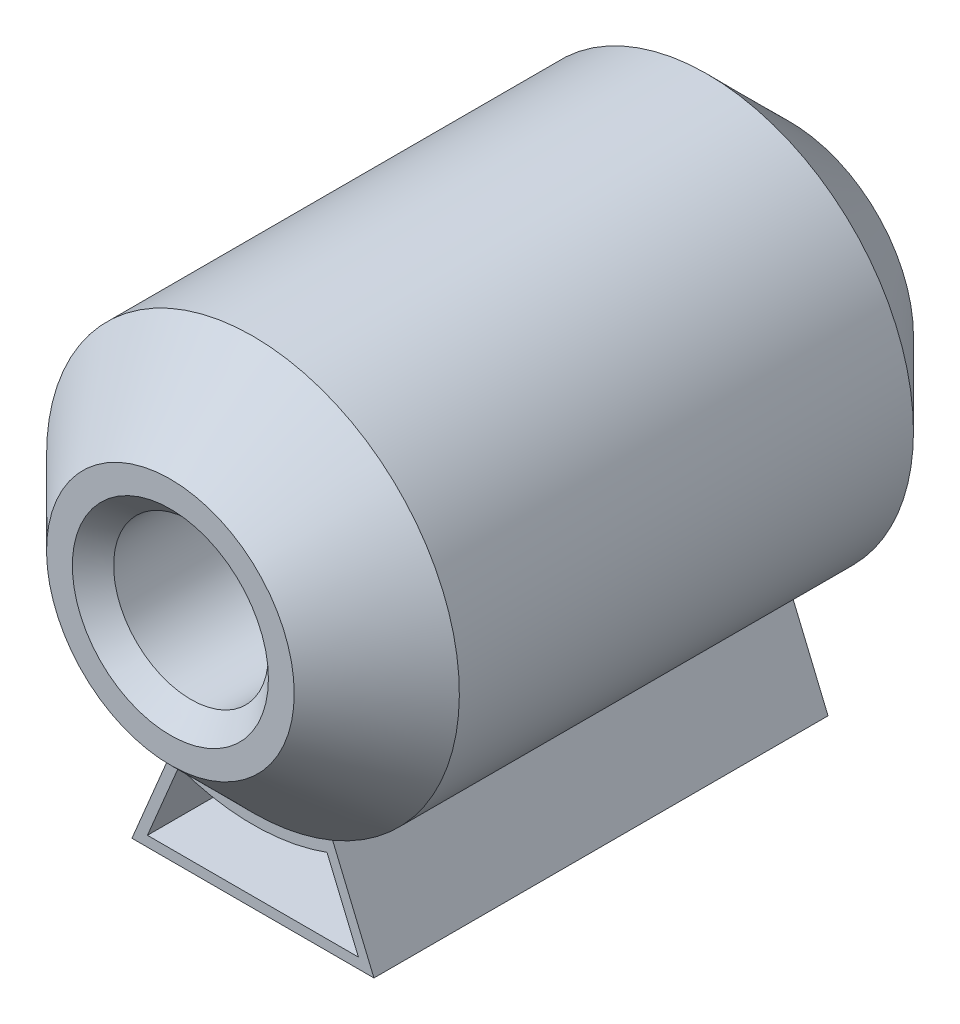
ISO-10303-21;
HEADER;
FILE_DESCRIPTION(('STEP AP214'),'2;1');
FILE_NAME('part.step','',(''),(''),'','','');
FILE_SCHEMA(('AUTOMOTIVE_DESIGN { 1 0 10303 214 1 1 1 1 }'));
ENDSEC;
DATA;
#1=APPLICATION_CONTEXT('core data for automotive mechanical design processes');
#2=APPLICATION_PROTOCOL_DEFINITION('international standard','automotive_design',2000,#1);
#3=PRODUCT_CONTEXT('',#1,'mechanical');
#4=PRODUCT('Part','Part','',(#3));
#5=PRODUCT_RELATED_PRODUCT_CATEGORY('part','',(#4));
#6=PRODUCT_DEFINITION_FORMATION('','',#4);
#7=PRODUCT_DEFINITION_CONTEXT('part definition',#1,'design');
#8=PRODUCT_DEFINITION('design','',#6,#7);
#9=PRODUCT_DEFINITION_SHAPE('','',#8);
#10=(LENGTH_UNIT() NAMED_UNIT(*) SI_UNIT(.MILLI.,.METRE.));
#11=(NAMED_UNIT(*) PLANE_ANGLE_UNIT() SI_UNIT($,.RADIAN.));
#12=(NAMED_UNIT(*) SI_UNIT($,.STERADIAN.) SOLID_ANGLE_UNIT());
#13=UNCERTAINTY_MEASURE_WITH_UNIT(LENGTH_MEASURE(1.E-05),#10,'distance_accuracy_value','');
#14=(GEOMETRIC_REPRESENTATION_CONTEXT(3) GLOBAL_UNCERTAINTY_ASSIGNED_CONTEXT((#13)) GLOBAL_UNIT_ASSIGNED_CONTEXT((#10,
#11,#12)) REPRESENTATION_CONTEXT('',''));
#15=CARTESIAN_POINT('',(0.,0.,0.));
#16=DIRECTION('',(0.,0.,1.));
#17=DIRECTION('',(1.,0.,0.));
#18=AXIS2_PLACEMENT_3D('',#15,#16,#17);
#19=CARTESIAN_POINT('',(0.,0.,15.));
#20=DIRECTION('',(0.,0.,-1.));
#21=DIRECTION('',(-1.,0.,0.));
#22=AXIS2_PLACEMENT_3D('',#19,#20,#21);
#23=CYLINDRICAL_SURFACE('',#22,10.);
#24=CARTESIAN_POINT('',(0.,0.,11.));
#25=DIRECTION('',(0.,0.,1.));
#26=DIRECTION('',(1.,0.,0.));
#27=AXIS2_PLACEMENT_3D('',#24,#25,#26);
#28=CIRCLE('',#27,10.);
#29=CARTESIAN_POINT('',(-3.86254924295217,-9.22392071441259,11.));
#30=VERTEX_POINT('',#29);
#31=CARTESIAN_POINT('',(3.86254924295217,-9.22392071441259,11.));
#32=VERTEX_POINT('',#31);
#33=EDGE_CURVE('E195',#30,#32,#28,.F.);
#34=ORIENTED_EDGE('',*,*,#33,.T.);
#35=DIRECTION('',(0.,0.,1.));
#36=VECTOR('',#35,1.);
#37=CARTESIAN_POINT('',(3.86254924295217,-9.22392071441259,-11.));
#38=LINE('',#37,#36);
#39=CARTESIAN_POINT('',(3.86254924295217,-9.22392071441259,-11.));
#40=VERTEX_POINT('',#39);
#41=EDGE_CURVE('E64',#40,#32,#38,.T.);
#42=ORIENTED_EDGE('',*,*,#41,.F.);
#43=CARTESIAN_POINT('',(0.,0.,-11.));
#44=DIRECTION('',(0.,0.,1.));
#45=DIRECTION('',(1.,0.,0.));
#46=AXIS2_PLACEMENT_3D('',#43,#44,#45);
#47=CIRCLE('',#46,10.);
#48=CARTESIAN_POINT('',(-3.86254924295217,-9.22392071441259,-11.));
#49=VERTEX_POINT('',#48);
#50=EDGE_CURVE('E68',#40,#49,#47,.T.);
#51=ORIENTED_EDGE('',*,*,#50,.T.);
#52=DIRECTION('',(0.,0.,1.));
#53=VECTOR('',#52,1.);
#54=CARTESIAN_POINT('',(-3.86254924295217,-9.22392071441259,-11.));
#55=LINE('',#54,#53);
#56=EDGE_CURVE('E182',#49,#30,#55,.T.);
#57=ORIENTED_EDGE('',*,*,#56,.T.);
#58=EDGE_LOOP('',(#34,#42,#51,#57));
#59=FACE_BOUND('',#58,.T.);
#60=ADVANCED_FACE('F47',(#59),#23,.T.);
#61=CARTESIAN_POINT('',(0.,0.,15.));
#62=DIRECTION('',(0.,0.,1.));
#63=DIRECTION('',(1.,0.,0.));
#64=AXIS2_PLACEMENT_3D('',#61,#62,#63);
#65=PLANE('',#64);
#66=CARTESIAN_POINT('',(0.,0.,15.));
#67=DIRECTION('',(0.,0.,1.));
#68=DIRECTION('',(1.,0.,0.));
#69=AXIS2_PLACEMENT_3D('',#66,#67,#68);
#70=CIRCLE('',#69,4.75000000000001);
#71=CARTESIAN_POINT('',(4.75000000000001,0.,15.));
#72=VERTEX_POINT('',#71);
#73=EDGE_CURVE('E11',#72,#72,#70,.F.);
#74=ORIENTED_EDGE('',*,*,#73,.T.);
#75=EDGE_LOOP('',(#74));
#76=FACE_BOUND('',#75,.T.);
#77=CARTESIAN_POINT('',(0.,0.,15.));
#78=DIRECTION('',(0.,0.,1.));
#79=DIRECTION('',(1.,0.,0.));
#80=AXIS2_PLACEMENT_3D('',#77,#78,#79);
#81=CIRCLE('',#80,6.);
#82=CARTESIAN_POINT('',(6.,0.,15.));
#83=VERTEX_POINT('',#82);
#84=EDGE_CURVE('E216',#83,#83,#81,.T.);
#85=ORIENTED_EDGE('',*,*,#84,.T.);
#86=EDGE_LOOP('',(#85));
#87=FACE_BOUND('',#86,.T.);
#88=ADVANCED_FACE('F243',(#76,#87),#65,.T.);
#89=CARTESIAN_POINT('',(0.,0.,-15.));
#90=DIRECTION('',(0.,0.,1.));
#91=DIRECTION('',(1.,0.,0.));
#92=AXIS2_PLACEMENT_3D('',#89,#90,#91);
#93=PLANE('',#92);
#94=CARTESIAN_POINT('',(0.,0.,-15.));
#95=DIRECTION('',(0.,0.,1.));
#96=DIRECTION('',(1.,0.,0.));
#97=AXIS2_PLACEMENT_3D('',#94,#95,#96);
#98=CIRCLE('',#97,4.75000000000001);
#99=CARTESIAN_POINT('',(4.75000000000001,0.,-15.));
#100=VERTEX_POINT('',#99);
#101=EDGE_CURVE('E220',#100,#100,#98,.T.);
#102=ORIENTED_EDGE('',*,*,#101,.T.);
#103=EDGE_LOOP('',(#102));
#104=FACE_BOUND('',#103,.T.);
#105=CARTESIAN_POINT('',(0.,0.,-15.));
#106=DIRECTION('',(0.,0.,1.));
#107=DIRECTION('',(1.,0.,0.));
#108=AXIS2_PLACEMENT_3D('',#105,#106,#107);
#109=CIRCLE('',#108,5.99999999999998);
#110=CARTESIAN_POINT('',(5.99999999999998,0.,-15.));
#111=VERTEX_POINT('',#110);
#112=EDGE_CURVE('E212',#111,#111,#109,.F.);
#113=ORIENTED_EDGE('',*,*,#112,.T.);
#114=EDGE_LOOP('',(#113));
#115=FACE_BOUND('',#114,.T.);
#116=ADVANCED_FACE('F239',(#104,#115),#93,.F.);
#117=CARTESIAN_POINT('',(0.,0.,-11.));
#118=DIRECTION('',(0.,0.,1.));
#119=DIRECTION('',(1.,0.,0.));
#120=AXIS2_PLACEMENT_3D('',#117,#118,#119);
#121=CONICAL_SURFACE('',#120,10.,0.78539816339745);
#122=ORIENTED_EDGE('',*,*,#112,.F.);
#123=EDGE_LOOP('',(#122));
#124=FACE_BOUND('',#123,.T.);
#125=EDGE_CURVE('E208',#49,#40,#47,.T.);
#126=ORIENTED_EDGE('',*,*,#125,.F.);
#127=ORIENTED_EDGE('',*,*,#50,.F.);
#128=EDGE_LOOP('',(#126,#127));
#129=FACE_BOUND('',#128,.T.);
#130=ADVANCED_FACE('F242',(#124,#129),#121,.T.);
#131=CARTESIAN_POINT('',(0.,0.,15.));
#132=DIRECTION('',(0.,0.,-1.));
#133=DIRECTION('',(-1.,0.,0.));
#134=AXIS2_PLACEMENT_3D('',#131,#132,#133);
#135=CONICAL_SURFACE('',#134,6.,0.785398163397447);
#136=EDGE_CURVE('E204',#32,#30,#28,.F.);
#137=ORIENTED_EDGE('',*,*,#136,.F.);
#138=ORIENTED_EDGE('',*,*,#33,.F.);
#139=EDGE_LOOP('',(#137,#138));
#140=FACE_BOUND('',#139,.T.);
#141=ORIENTED_EDGE('',*,*,#84,.F.);
#142=EDGE_LOOP('',(#141));
#143=FACE_BOUND('',#142,.T.);
#144=ADVANCED_FACE('F249',(#140,#143),#135,.T.);
#145=CARTESIAN_POINT('',(0.,0.,-15.));
#146=DIRECTION('',(0.,0.,1.));
#147=DIRECTION('',(1.,0.,0.));
#148=AXIS2_PLACEMENT_3D('',#145,#146,#147);
#149=CYLINDRICAL_SURFACE('',#148,3.75);
#150=CARTESIAN_POINT('',(0.,0.,-14.));
#151=DIRECTION('',(0.,0.,1.));
#152=DIRECTION('',(1.,0.,0.));
#153=AXIS2_PLACEMENT_3D('',#150,#151,#152);
#154=CIRCLE('',#153,3.75);
#155=CARTESIAN_POINT('',(3.75,0.,-14.));
#156=VERTEX_POINT('',#155);
#157=EDGE_CURVE('E57',#156,#156,#154,.F.);
#158=ORIENTED_EDGE('',*,*,#157,.T.);
#159=EDGE_LOOP('',(#158));
#160=FACE_BOUND('',#159,.T.);
#161=CARTESIAN_POINT('',(0.,0.,14.));
#162=DIRECTION('',(0.,0.,1.));
#163=DIRECTION('',(1.,0.,0.));
#164=AXIS2_PLACEMENT_3D('',#161,#162,#163);
#165=CIRCLE('',#164,3.75);
#166=CARTESIAN_POINT('',(3.75,0.,14.));
#167=VERTEX_POINT('',#166);
#168=EDGE_CURVE('E224',#167,#167,#165,.T.);
#169=ORIENTED_EDGE('',*,*,#168,.T.);
#170=EDGE_LOOP('',(#169));
#171=FACE_BOUND('',#170,.T.);
#172=ADVANCED_FACE('F231',(#160,#171),#149,.F.);
#173=CARTESIAN_POINT('',(0.,0.,-15.));
#174=DIRECTION('',(0.,0.,-1.));
#175=DIRECTION('',(-1.,0.,0.));
#176=AXIS2_PLACEMENT_3D('',#173,#174,#175);
#177=CONICAL_SURFACE('',#176,4.75000000000001,0.785398163397447);
#178=ORIENTED_EDGE('',*,*,#157,.F.);
#179=EDGE_LOOP('',(#178));
#180=FACE_BOUND('',#179,.T.);
#181=ORIENTED_EDGE('',*,*,#101,.F.);
#182=EDGE_LOOP('',(#181));
#183=FACE_BOUND('',#182,.T.);
#184=ADVANCED_FACE('F234',(#180,#183),#177,.F.);
#185=CARTESIAN_POINT('',(0.,0.,14.));
#186=DIRECTION('',(0.,0.,1.));
#187=DIRECTION('',(1.,0.,0.));
#188=AXIS2_PLACEMENT_3D('',#185,#186,#187);
#189=CONICAL_SURFACE('',#188,3.75,0.78539816339745);
#190=ORIENTED_EDGE('',*,*,#73,.F.);
#191=EDGE_LOOP('',(#190));
#192=FACE_BOUND('',#191,.T.);
#193=ORIENTED_EDGE('',*,*,#168,.F.);
#194=EDGE_LOOP('',(#193));
#195=FACE_BOUND('',#194,.T.);
#196=ADVANCED_FACE('F50',(#192,#195),#189,.F.);
#197=CARTESIAN_POINT('',(5.86254924295217,-14.,-11.));
#198=DIRECTION('',(0.922392071441259,0.386254924295217,0.));
#199=DIRECTION('',(-0.386254924295217,0.922392071441259,0.));
#200=AXIS2_PLACEMENT_3D('',#197,#198,#199);
#201=PLANE('',#200);
#202=DIRECTION('',(-0.386254924295217,0.922392071441259,0.));
#203=VECTOR('',#202,1.);
#204=CARTESIAN_POINT('',(5.86254924295217,-14.,11.));
#205=LINE('',#204,#203);
#206=CARTESIAN_POINT('',(5.86254924295217,-14.,11.));
#207=VERTEX_POINT('',#206);
#208=EDGE_CURVE('E174',#207,#32,#205,.T.);
#209=ORIENTED_EDGE('',*,*,#208,.F.);
#210=DIRECTION('',(0.,0.,1.));
#211=VECTOR('',#210,1.);
#212=CARTESIAN_POINT('',(5.86254924295217,-14.,-11.));
#213=LINE('',#212,#211);
#214=CARTESIAN_POINT('',(5.86254924295217,-14.,-11.));
#215=VERTEX_POINT('',#214);
#216=EDGE_CURVE('E196',#215,#207,#213,.T.);
#217=ORIENTED_EDGE('',*,*,#216,.F.);
#218=DIRECTION('',(-0.386254924295217,0.922392071441259,0.));
#219=VECTOR('',#218,1.);
#220=CARTESIAN_POINT('',(5.86254924295217,-14.,-11.));
#221=LINE('',#220,#219);
#222=EDGE_CURVE('E178',#215,#40,#221,.T.);
#223=ORIENTED_EDGE('',*,*,#222,.T.);
#224=ORIENTED_EDGE('',*,*,#41,.T.);
#225=EDGE_LOOP('',(#209,#217,#223,#224));
#226=FACE_BOUND('',#225,.T.);
#227=ADVANCED_FACE('F268',(#226),#201,.T.);
#228=CARTESIAN_POINT('',(-5.86254924295217,-14.,-11.));
#229=DIRECTION('',(0.,-1.,0.));
#230=DIRECTION('',(0.,0.,-1.));
#231=AXIS2_PLACEMENT_3D('',#228,#229,#230);
#232=PLANE('',#231);
#233=DIRECTION('',(1.,0.,0.));
#234=VECTOR('',#233,1.);
#235=CARTESIAN_POINT('',(-5.86254924295217,-14.,11.));
#236=LINE('',#235,#234);
#237=CARTESIAN_POINT('',(-5.86254924295217,-14.,11.));
#238=VERTEX_POINT('',#237);
#239=EDGE_CURVE('E186',#238,#207,#236,.T.);
#240=ORIENTED_EDGE('',*,*,#239,.F.);
#241=DIRECTION('',(0.,0.,1.));
#242=VECTOR('',#241,1.);
#243=CARTESIAN_POINT('',(-5.86254924295217,-14.,-11.));
#244=LINE('',#243,#242);
#245=CARTESIAN_POINT('',(-5.86254924295217,-14.,-11.));
#246=VERTEX_POINT('',#245);
#247=EDGE_CURVE('E199',#246,#238,#244,.T.);
#248=ORIENTED_EDGE('',*,*,#247,.F.);
#249=DIRECTION('',(1.,0.,0.));
#250=VECTOR('',#249,1.);
#251=CARTESIAN_POINT('',(-5.86254924295217,-14.,-11.));
#252=LINE('',#251,#250);
#253=EDGE_CURVE('E173',#246,#215,#252,.T.);
#254=ORIENTED_EDGE('',*,*,#253,.T.);
#255=ORIENTED_EDGE('',*,*,#216,.T.);
#256=EDGE_LOOP('',(#240,#248,#254,#255));
#257=FACE_BOUND('',#256,.T.);
#258=ADVANCED_FACE('F260',(#257),#232,.T.);
#259=CARTESIAN_POINT('',(-3.86254924295217,-9.22392071441259,-11.));
#260=DIRECTION('',(-0.922392071441259,0.386254924295217,0.));
#261=DIRECTION('',(-0.386254924295217,-0.922392071441259,0.));
#262=AXIS2_PLACEMENT_3D('',#259,#260,#261);
#263=PLANE('',#262);
#264=DIRECTION('',(-0.386254924295217,-0.922392071441259,0.));
#265=VECTOR('',#264,1.);
#266=CARTESIAN_POINT('',(-3.86254924295217,-9.22392071441259,11.));
#267=LINE('',#266,#265);
#268=EDGE_CURVE('E163',#30,#238,#267,.T.);
#269=ORIENTED_EDGE('',*,*,#268,.F.);
#270=ORIENTED_EDGE('',*,*,#56,.F.);
#271=DIRECTION('',(-0.386254924295217,-0.922392071441259,0.));
#272=VECTOR('',#271,1.);
#273=CARTESIAN_POINT('',(-3.86254924295217,-9.22392071441259,-11.));
#274=LINE('',#273,#272);
#275=EDGE_CURVE('E169',#49,#246,#274,.T.);
#276=ORIENTED_EDGE('',*,*,#275,.T.);
#277=ORIENTED_EDGE('',*,*,#247,.T.);
#278=EDGE_LOOP('',(#269,#270,#276,#277));
#279=FACE_BOUND('',#278,.T.);
#280=ADVANCED_FACE('F256',(#279),#263,.T.);
#281=CARTESIAN_POINT('',(0.,0.,-11.));
#282=DIRECTION('',(0.,0.,-1.));
#283=DIRECTION('',(-1.,0.,0.));
#284=AXIS2_PLACEMENT_3D('',#281,#282,#283);
#285=PLANE('',#284);
#286=CARTESIAN_POINT('',(0.,0.,-11.));
#287=DIRECTION('',(0.,0.,-1.));
#288=DIRECTION('',(-1.,0.,0.));
#289=AXIS2_PLACEMENT_3D('',#286,#287,#288);
#290=CIRCLE('',#289,10.5);
#291=CARTESIAN_POINT('',(3.58987978678052,-9.86725712224347,-11.));
#292=VERTEX_POINT('',#291);
#293=CARTESIAN_POINT('',(-3.58987978678052,-9.86725712224347,-11.));
#294=VERTEX_POINT('',#293);
#295=EDGE_CURVE('E117',#292,#294,#290,.T.);
#296=ORIENTED_EDGE('',*,*,#295,.T.);
#297=DIRECTION('',(-0.386254924295217,-0.922392071441259,0.));
#298=VECTOR('',#297,1.);
#299=CARTESIAN_POINT('',(-3.58987978678052,-9.86725712224347,-11.));
#300=LINE('',#299,#298);
#301=CARTESIAN_POINT('',(-5.11110364448276,-13.5,-11.));
#302=VERTEX_POINT('',#301);
#303=EDGE_CURVE('E130',#294,#302,#300,.T.);
#304=ORIENTED_EDGE('',*,*,#303,.T.);
#305=DIRECTION('',(1.,0.,0.));
#306=VECTOR('',#305,1.);
#307=CARTESIAN_POINT('',(-5.11110364448276,-13.5,-11.));
#308=LINE('',#307,#306);
#309=CARTESIAN_POINT('',(5.11110364448276,-13.5,-11.));
#310=VERTEX_POINT('',#309);
#311=EDGE_CURVE('E135',#302,#310,#308,.T.);
#312=ORIENTED_EDGE('',*,*,#311,.T.);
#313=DIRECTION('',(-0.386254924295216,0.922392071441259,0.));
#314=VECTOR('',#313,1.);
#315=CARTESIAN_POINT('',(5.11110364448276,-13.5,-11.));
#316=LINE('',#315,#314);
#317=EDGE_CURVE('E126',#310,#292,#316,.T.);
#318=ORIENTED_EDGE('',*,*,#317,.T.);
#319=EDGE_LOOP('',(#296,#304,#312,#318));
#320=FACE_BOUND('',#319,.T.);
#321=ORIENTED_EDGE('',*,*,#125,.T.);
#322=ORIENTED_EDGE('',*,*,#222,.F.);
#323=ORIENTED_EDGE('',*,*,#253,.F.);
#324=ORIENTED_EDGE('',*,*,#275,.F.);
#325=EDGE_LOOP('',(#321,#322,#323,#324));
#326=FACE_BOUND('',#325,.T.);
#327=ADVANCED_FACE('F137',(#320,#326),#285,.T.);
#328=CARTESIAN_POINT('',(0.,0.,11.));
#329=DIRECTION('',(0.,0.,-1.));
#330=DIRECTION('',(-1.,0.,0.));
#331=AXIS2_PLACEMENT_3D('',#328,#329,#330);
#332=PLANE('',#331);
#333=DIRECTION('',(-0.386254924295217,-0.922392071441259,0.));
#334=VECTOR('',#333,1.);
#335=CARTESIAN_POINT('',(-3.58987978678052,-9.86725712224347,11.));
#336=LINE('',#335,#334);
#337=CARTESIAN_POINT('',(-3.58987978678052,-9.86725712224347,11.));
#338=VERTEX_POINT('',#337);
#339=CARTESIAN_POINT('',(-5.11110364448276,-13.5,11.));
#340=VERTEX_POINT('',#339);
#341=EDGE_CURVE('E154',#338,#340,#336,.T.);
#342=ORIENTED_EDGE('',*,*,#341,.F.);
#343=CARTESIAN_POINT('',(0.,0.,11.));
#344=DIRECTION('',(0.,0.,-1.));
#345=DIRECTION('',(-1.,0.,0.));
#346=AXIS2_PLACEMENT_3D('',#343,#344,#345);
#347=CIRCLE('',#346,10.5);
#348=CARTESIAN_POINT('',(3.58987978678052,-9.86725712224347,11.));
#349=VERTEX_POINT('',#348);
#350=EDGE_CURVE('E120',#349,#338,#347,.T.);
#351=ORIENTED_EDGE('',*,*,#350,.F.);
#352=DIRECTION('',(-0.386254924295216,0.922392071441259,0.));
#353=VECTOR('',#352,1.);
#354=CARTESIAN_POINT('',(5.11110364448276,-13.5,11.));
#355=LINE('',#354,#353);
#356=CARTESIAN_POINT('',(5.11110364448276,-13.5,11.));
#357=VERTEX_POINT('',#356);
#358=EDGE_CURVE('E141',#357,#349,#355,.T.);
#359=ORIENTED_EDGE('',*,*,#358,.F.);
#360=DIRECTION('',(1.,0.,0.));
#361=VECTOR('',#360,1.);
#362=CARTESIAN_POINT('',(-5.11110364448276,-13.5,11.));
#363=LINE('',#362,#361);
#364=EDGE_CURVE('E145',#340,#357,#363,.T.);
#365=ORIENTED_EDGE('',*,*,#364,.F.);
#366=EDGE_LOOP('',(#342,#351,#359,#365));
#367=FACE_BOUND('',#366,.T.);
#368=ORIENTED_EDGE('',*,*,#136,.T.);
#369=ORIENTED_EDGE('',*,*,#268,.T.);
#370=ORIENTED_EDGE('',*,*,#239,.T.);
#371=ORIENTED_EDGE('',*,*,#208,.T.);
#372=EDGE_LOOP('',(#368,#369,#370,#371));
#373=FACE_BOUND('',#372,.T.);
#374=ADVANCED_FACE('F263',(#367,#373),#332,.F.);
#375=CARTESIAN_POINT('',(0.,0.,-11.));
#376=DIRECTION('',(0.,0.,1.));
#377=DIRECTION('',(1.,0.,0.));
#378=AXIS2_PLACEMENT_3D('',#375,#376,#377);
#379=CYLINDRICAL_SURFACE('',#378,10.5);
#380=ORIENTED_EDGE('',*,*,#350,.T.);
#381=DIRECTION('',(0.,0.,1.));
#382=VECTOR('',#381,1.);
#383=CARTESIAN_POINT('',(-3.58987978678052,-9.86725712224347,-11.));
#384=LINE('',#383,#382);
#385=EDGE_CURVE('E113',#294,#338,#384,.T.);
#386=ORIENTED_EDGE('',*,*,#385,.F.);
#387=ORIENTED_EDGE('',*,*,#295,.F.);
#388=DIRECTION('',(0.,0.,1.));
#389=VECTOR('',#388,1.);
#390=CARTESIAN_POINT('',(3.58987978678052,-9.86725712224347,-11.));
#391=LINE('',#390,#389);
#392=EDGE_CURVE('E160',#292,#349,#391,.T.);
#393=ORIENTED_EDGE('',*,*,#392,.T.);
#394=EDGE_LOOP('',(#380,#386,#387,#393));
#395=FACE_BOUND('',#394,.T.);
#396=ADVANCED_FACE('F115',(#395),#379,.T.);
#397=CARTESIAN_POINT('',(5.11110364448276,-13.5,-11.));
#398=DIRECTION('',(0.922392071441259,0.386254924295216,0.));
#399=DIRECTION('',(-0.386254924295216,0.922392071441259,0.));
#400=AXIS2_PLACEMENT_3D('',#397,#398,#399);
#401=PLANE('',#400);
#402=ORIENTED_EDGE('',*,*,#358,.T.);
#403=ORIENTED_EDGE('',*,*,#392,.F.);
#404=ORIENTED_EDGE('',*,*,#317,.F.);
#405=DIRECTION('',(0.,0.,1.));
#406=VECTOR('',#405,1.);
#407=CARTESIAN_POINT('',(5.11110364448276,-13.5,-11.));
#408=LINE('',#407,#406);
#409=EDGE_CURVE('E164',#310,#357,#408,.T.);
#410=ORIENTED_EDGE('',*,*,#409,.T.);
#411=EDGE_LOOP('',(#402,#403,#404,#410));
#412=FACE_BOUND('',#411,.T.);
#413=ADVANCED_FACE('F317',(#412),#401,.F.);
#414=CARTESIAN_POINT('',(-5.11110364448276,-13.5,-11.));
#415=DIRECTION('',(0.,-1.,0.));
#416=DIRECTION('',(0.,0.,-1.));
#417=AXIS2_PLACEMENT_3D('',#414,#415,#416);
#418=PLANE('',#417);
#419=ORIENTED_EDGE('',*,*,#364,.T.);
#420=ORIENTED_EDGE('',*,*,#409,.F.);
#421=ORIENTED_EDGE('',*,*,#311,.F.);
#422=DIRECTION('',(0.,0.,1.));
#423=VECTOR('',#422,1.);
#424=CARTESIAN_POINT('',(-5.11110364448276,-13.5,-11.));
#425=LINE('',#424,#423);
#426=EDGE_CURVE('E125',#302,#340,#425,.T.);
#427=ORIENTED_EDGE('',*,*,#426,.T.);
#428=EDGE_LOOP('',(#419,#420,#421,#427));
#429=FACE_BOUND('',#428,.T.);
#430=ADVANCED_FACE('F320',(#429),#418,.F.);
#431=CARTESIAN_POINT('',(-3.58987978678052,-9.86725712224347,-11.));
#432=DIRECTION('',(-0.922392071441259,0.386254924295217,0.));
#433=DIRECTION('',(-0.386254924295217,-0.922392071441259,0.));
#434=AXIS2_PLACEMENT_3D('',#431,#432,#433);
#435=PLANE('',#434);
#436=ORIENTED_EDGE('',*,*,#341,.T.);
#437=ORIENTED_EDGE('',*,*,#426,.F.);
#438=ORIENTED_EDGE('',*,*,#303,.F.);
#439=ORIENTED_EDGE('',*,*,#385,.T.);
#440=EDGE_LOOP('',(#436,#437,#438,#439));
#441=FACE_BOUND('',#440,.T.);
#442=ADVANCED_FACE('F131',(#441),#435,.F.);
#443=CLOSED_SHELL('',(#60,#88,#116,#130,#144,#172,#184,#196,#227,#258,#280,#327,#374,#396,#413,
#430,#442));
#444=MANIFOLD_SOLID_BREP('B2',#443);
#445=ADVANCED_BREP_SHAPE_REPRESENTATION('',(#18,#444),#14);
#446=SHAPE_DEFINITION_REPRESENTATION(#9,#445);
ENDSEC;
END-ISO-10303-21;
